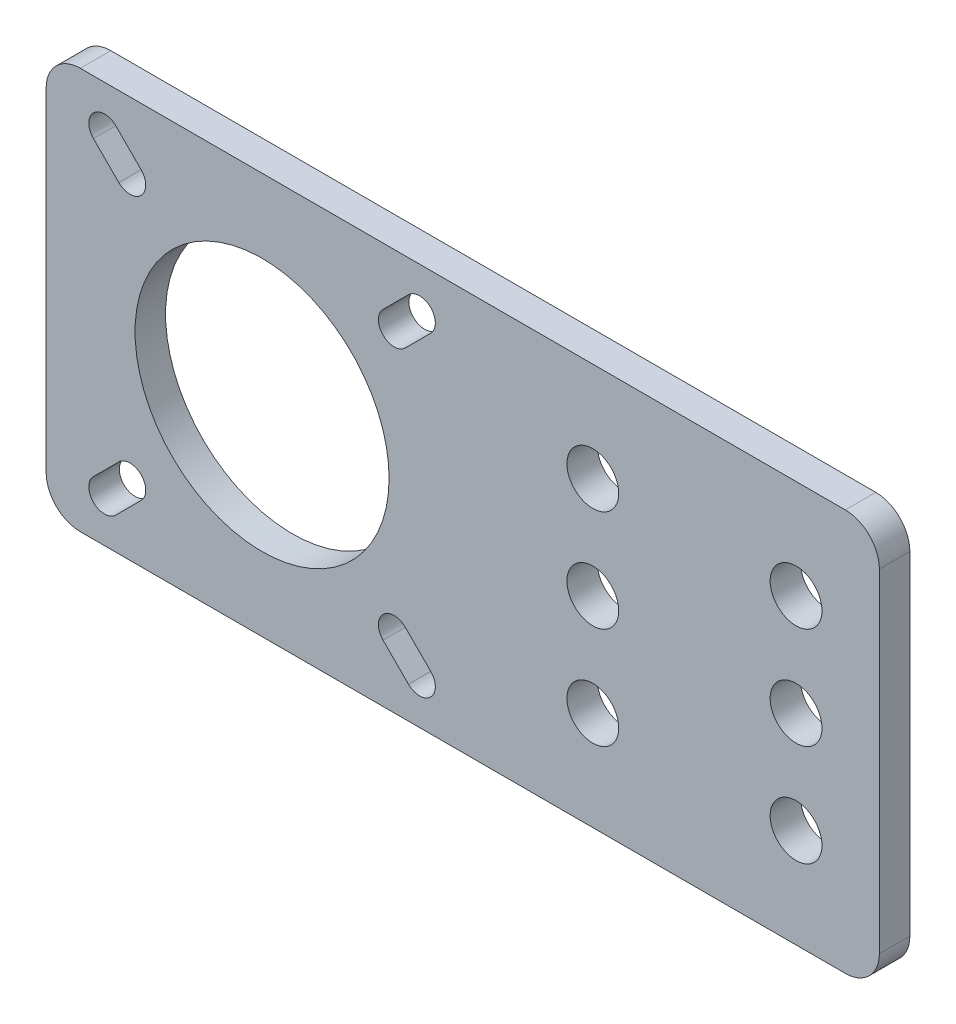
ISO-10303-21;
HEADER;
FILE_DESCRIPTION(('STEP AP214'),'2;1');
FILE_NAME('part.step','',(''),(''),'','','');
FILE_SCHEMA(('AUTOMOTIVE_DESIGN { 1 0 10303 214 1 1 1 1 }'));
ENDSEC;
DATA;
#1=APPLICATION_CONTEXT('core data for automotive mechanical design processes');
#2=APPLICATION_PROTOCOL_DEFINITION('international standard','automotive_design',2000,#1);
#3=PRODUCT_CONTEXT('',#1,'mechanical');
#4=PRODUCT('Part','Part','',(#3));
#5=PRODUCT_RELATED_PRODUCT_CATEGORY('part','',(#4));
#6=PRODUCT_DEFINITION_FORMATION('','',#4);
#7=PRODUCT_DEFINITION_CONTEXT('part definition',#1,'design');
#8=PRODUCT_DEFINITION('design','',#6,#7);
#9=PRODUCT_DEFINITION_SHAPE('','',#8);
#10=(LENGTH_UNIT() NAMED_UNIT(*) SI_UNIT(.MILLI.,.METRE.));
#11=(NAMED_UNIT(*) PLANE_ANGLE_UNIT() SI_UNIT($,.RADIAN.));
#12=(NAMED_UNIT(*) SI_UNIT($,.STERADIAN.) SOLID_ANGLE_UNIT());
#13=UNCERTAINTY_MEASURE_WITH_UNIT(LENGTH_MEASURE(1.E-05),#10,'distance_accuracy_value','');
#14=(GEOMETRIC_REPRESENTATION_CONTEXT(3) GLOBAL_UNCERTAINTY_ASSIGNED_CONTEXT((#13)) GLOBAL_UNIT_ASSIGNED_CONTEXT((#10,
#11,#12)) REPRESENTATION_CONTEXT('',''));
#15=CARTESIAN_POINT('',(0.,0.,0.));
#16=DIRECTION('',(0.,0.,1.));
#17=DIRECTION('',(1.,0.,0.));
#18=AXIS2_PLACEMENT_3D('',#15,#16,#17);
#19=CARTESIAN_POINT('',(-37.64,-16.39,1.5));
#20=DIRECTION('',(0.,0.,-1.));
#21=DIRECTION('',(-1.,0.,0.));
#22=AXIS2_PLACEMENT_3D('',#19,#20,#21);
#23=PLANE('',#22);
#24=CARTESIAN_POINT('',(12.8,-10.,1.5));
#25=DIRECTION('',(0.,0.,1.));
#26=DIRECTION('',(1.,0.,0.));
#27=AXIS2_PLACEMENT_3D('',#24,#25,#26);
#28=CIRCLE('',#27,2.55);
#29=CARTESIAN_POINT('',(15.35,-10.,1.5));
#30=VERTEX_POINT('',#29);
#31=EDGE_CURVE('E482',#30,#30,#28,.T.);
#32=ORIENTED_EDGE('',*,*,#31,.F.);
#33=EDGE_LOOP('',(#32));
#34=FACE_BOUND('',#33,.T.);
#35=CARTESIAN_POINT('',(12.8,0.,1.5));
#36=DIRECTION('',(0.,0.,1.));
#37=DIRECTION('',(1.,0.,0.));
#38=AXIS2_PLACEMENT_3D('',#35,#36,#37);
#39=CIRCLE('',#38,2.5500000000001);
#40=CARTESIAN_POINT('',(15.3500000000001,0.,1.5));
#41=VERTEX_POINT('',#40);
#42=EDGE_CURVE('E492',#41,#41,#39,.T.);
#43=ORIENTED_EDGE('',*,*,#42,.F.);
#44=EDGE_LOOP('',(#43));
#45=FACE_BOUND('',#44,.T.);
#46=CARTESIAN_POINT('',(12.8,10.,1.5));
#47=DIRECTION('',(0.,0.,1.));
#48=DIRECTION('',(1.,0.,0.));
#49=AXIS2_PLACEMENT_3D('',#46,#47,#48);
#50=CIRCLE('',#49,2.55);
#51=CARTESIAN_POINT('',(15.35,10.,1.5));
#52=VERTEX_POINT('',#51);
#53=EDGE_CURVE('E222',#52,#52,#50,.T.);
#54=ORIENTED_EDGE('',*,*,#53,.F.);
#55=EDGE_LOOP('',(#54));
#56=FACE_BOUND('',#55,.T.);
#57=CARTESIAN_POINT('',(-4.2499999999999,-15.5000000000001,1.5));
#58=DIRECTION('',(0.,0.,1.));
#59=DIRECTION('',(1.,0.,0.));
#60=AXIS2_PLACEMENT_3D('',#57,#58,#59);
#61=CIRCLE('',#60,1.55);
#62=CARTESIAN_POINT('',(-5.34601551083905,-16.5960155108392,1.5));
#63=VERTEX_POINT('',#62);
#64=CARTESIAN_POINT('',(-3.15398448916075,-14.4039844891609,1.5));
#65=VERTEX_POINT('',#64);
#66=EDGE_CURVE('E232',#63,#65,#61,.T.);
#67=ORIENTED_EDGE('',*,*,#66,.F.);
#68=DIRECTION('',(0.707106781186546,-0.707106781186549,0.));
#69=VECTOR('',#68,1.);
#70=CARTESIAN_POINT('',(-5.34601551083905,-16.5960155108392,1.5));
#71=LINE('',#70,#69);
#72=CARTESIAN_POINT('',(-7.84601551083907,-14.0960155108392,1.5));
#73=VERTEX_POINT('',#72);
#74=EDGE_CURVE('E240',#73,#63,#71,.T.);
#75=ORIENTED_EDGE('',*,*,#74,.F.);
#76=CARTESIAN_POINT('',(-6.74999999999991,-13.,1.5));
#77=DIRECTION('',(0.,0.,1.));
#78=DIRECTION('',(1.,0.,0.));
#79=AXIS2_PLACEMENT_3D('',#76,#77,#78);
#80=CIRCLE('',#79,1.55000000000001);
#81=CARTESIAN_POINT('',(-5.65398448916076,-11.9039844891609,1.5));
#82=VERTEX_POINT('',#81);
#83=EDGE_CURVE('E237',#82,#73,#80,.T.);
#84=ORIENTED_EDGE('',*,*,#83,.F.);
#85=DIRECTION('',(-0.707106781186545,0.70710678118655,0.));
#86=VECTOR('',#85,1.);
#87=CARTESIAN_POINT('',(-3.15398448916075,-14.4039844891609,1.5));
#88=LINE('',#87,#86);
#89=EDGE_CURVE('E234',#65,#82,#88,.T.);
#90=ORIENTED_EDGE('',*,*,#89,.F.);
#91=EDGE_LOOP('',(#67,#75,#84,#90));
#92=FACE_BOUND('',#91,.T.);
#93=CARTESIAN_POINT('',(-4.24999999999989,15.5,1.5));
#94=DIRECTION('',(0.,0.,1.));
#95=DIRECTION('',(1.,0.,0.));
#96=AXIS2_PLACEMENT_3D('',#93,#94,#95);
#97=CIRCLE('',#96,1.55000000000001);
#98=CARTESIAN_POINT('',(-3.15398448916074,14.4039844891609,1.5));
#99=VERTEX_POINT('',#98);
#100=CARTESIAN_POINT('',(-5.34601551083904,16.5960155108392,1.5));
#101=VERTEX_POINT('',#100);
#102=EDGE_CURVE('E294',#99,#101,#97,.T.);
#103=ORIENTED_EDGE('',*,*,#102,.F.);
#104=DIRECTION('',(0.70710678118655,0.707106781186545,0.));
#105=VECTOR('',#104,1.);
#106=CARTESIAN_POINT('',(-3.15398448916074,14.4039844891609,1.5));
#107=LINE('',#106,#105);
#108=CARTESIAN_POINT('',(-5.65398448916076,11.9039844891609,1.5));
#109=VERTEX_POINT('',#108);
#110=EDGE_CURVE('E302',#109,#99,#107,.T.);
#111=ORIENTED_EDGE('',*,*,#110,.F.);
#112=CARTESIAN_POINT('',(-6.74999999999992,13.,1.5));
#113=DIRECTION('',(0.,0.,1.));
#114=DIRECTION('',(1.,0.,0.));
#115=AXIS2_PLACEMENT_3D('',#112,#113,#114);
#116=CIRCLE('',#115,1.55000000000001);
#117=CARTESIAN_POINT('',(-7.84601551083907,14.0960155108392,1.5));
#118=VERTEX_POINT('',#117);
#119=EDGE_CURVE('E299',#118,#109,#116,.T.);
#120=ORIENTED_EDGE('',*,*,#119,.F.);
#121=DIRECTION('',(-0.70710678118655,-0.707106781186545,0.));
#122=VECTOR('',#121,1.);
#123=CARTESIAN_POINT('',(-5.34601551083904,16.5960155108392,1.5));
#124=LINE('',#123,#122);
#125=EDGE_CURVE('E296',#101,#118,#124,.T.);
#126=ORIENTED_EDGE('',*,*,#125,.F.);
#127=EDGE_LOOP('',(#103,#111,#120,#126));
#128=FACE_BOUND('',#127,.T.);
#129=CARTESIAN_POINT('',(-37.64,-16.39,1.5));
#130=DIRECTION('',(0.,0.,1.));
#131=DIRECTION('',(-1.,0.,0.));
#132=AXIS2_PLACEMENT_3D('',#129,#130,#131);
#133=CIRCLE('',#132,3.36);
#134=CARTESIAN_POINT('',(-41.,-16.39,1.5));
#135=VERTEX_POINT('',#134);
#136=CARTESIAN_POINT('',(-37.64,-19.75,1.5));
#137=VERTEX_POINT('',#136);
#138=EDGE_CURVE('E331',#135,#137,#133,.T.);
#139=ORIENTED_EDGE('',*,*,#138,.T.);
#140=DIRECTION('',(1.,0.,0.));
#141=VECTOR('',#140,1.);
#142=CARTESIAN_POINT('',(-37.64,-19.75,1.5));
#143=LINE('',#142,#141);
#144=CARTESIAN_POINT('',(37.64,-19.75,1.5));
#145=VERTEX_POINT('',#144);
#146=EDGE_CURVE('E334',#137,#145,#143,.T.);
#147=ORIENTED_EDGE('',*,*,#146,.T.);
#148=CARTESIAN_POINT('',(37.64,-16.39,1.5));
#149=DIRECTION('',(0.,0.,1.));
#150=DIRECTION('',(1.,0.,0.));
#151=AXIS2_PLACEMENT_3D('',#148,#149,#150);
#152=CIRCLE('',#151,3.36);
#153=CARTESIAN_POINT('',(41.,-16.39,1.5));
#154=VERTEX_POINT('',#153);
#155=EDGE_CURVE('E337',#145,#154,#152,.T.);
#156=ORIENTED_EDGE('',*,*,#155,.T.);
#157=DIRECTION('',(0.,1.,0.));
#158=VECTOR('',#157,1.);
#159=CARTESIAN_POINT('',(41.,-16.39,1.5));
#160=LINE('',#159,#158);
#161=CARTESIAN_POINT('',(41.,16.39,1.5));
#162=VERTEX_POINT('',#161);
#163=EDGE_CURVE('E339',#154,#162,#160,.T.);
#164=ORIENTED_EDGE('',*,*,#163,.T.);
#165=CARTESIAN_POINT('',(37.64,16.39,1.5));
#166=DIRECTION('',(0.,0.,1.));
#167=DIRECTION('',(-1.,0.,0.));
#168=AXIS2_PLACEMENT_3D('',#165,#166,#167);
#169=CIRCLE('',#168,3.36);
#170=CARTESIAN_POINT('',(37.64,19.75,1.5));
#171=VERTEX_POINT('',#170);
#172=EDGE_CURVE('E341',#162,#171,#169,.T.);
#173=ORIENTED_EDGE('',*,*,#172,.T.);
#174=DIRECTION('',(-1.,0.,0.));
#175=VECTOR('',#174,1.);
#176=CARTESIAN_POINT('',(-37.64,19.75,1.5));
#177=LINE('',#176,#175);
#178=CARTESIAN_POINT('',(-37.64,19.75,1.5));
#179=VERTEX_POINT('',#178);
#180=EDGE_CURVE('E343',#171,#179,#177,.T.);
#181=ORIENTED_EDGE('',*,*,#180,.T.);
#182=CARTESIAN_POINT('',(-37.64,16.39,1.5));
#183=DIRECTION('',(0.,0.,1.));
#184=DIRECTION('',(-1.,0.,0.));
#185=AXIS2_PLACEMENT_3D('',#182,#183,#184);
#186=CIRCLE('',#185,3.36);
#187=CARTESIAN_POINT('',(-41.,16.39,1.5));
#188=VERTEX_POINT('',#187);
#189=EDGE_CURVE('E345',#179,#188,#186,.T.);
#190=ORIENTED_EDGE('',*,*,#189,.T.);
#191=DIRECTION('',(0.,-1.,0.));
#192=VECTOR('',#191,1.);
#193=CARTESIAN_POINT('',(-41.,-16.39,1.5));
#194=LINE('',#193,#192);
#195=EDGE_CURVE('E347',#188,#135,#194,.T.);
#196=ORIENTED_EDGE('',*,*,#195,.T.);
#197=EDGE_LOOP('',(#139,#147,#156,#164,#173,#181,#190,#196));
#198=FACE_BOUND('',#197,.T.);
#199=CARTESIAN_POINT('',(-19.75,0.,1.5));
#200=DIRECTION('',(0.,0.,1.));
#201=DIRECTION('',(1.,0.,0.));
#202=AXIS2_PLACEMENT_3D('',#199,#200,#201);
#203=CIRCLE('',#202,12.5000000000001);
#204=CARTESIAN_POINT('',(-7.24999999999996,0.,1.5));
#205=VERTEX_POINT('',#204);
#206=EDGE_CURVE('E325',#205,#205,#203,.T.);
#207=ORIENTED_EDGE('',*,*,#206,.F.);
#208=EDGE_LOOP('',(#207));
#209=FACE_BOUND('',#208,.T.);
#210=CARTESIAN_POINT('',(-35.25,15.5000000000001,1.5));
#211=DIRECTION('',(0.,0.,1.));
#212=DIRECTION('',(1.,0.,0.));
#213=AXIS2_PLACEMENT_3D('',#210,#211,#212);
#214=CIRCLE('',#213,1.55);
#215=CARTESIAN_POINT('',(-34.1539844891608,16.5960155108392,1.5));
#216=VERTEX_POINT('',#215);
#217=CARTESIAN_POINT('',(-36.3460155108392,14.4039844891609,1.5));
#218=VERTEX_POINT('',#217);
#219=EDGE_CURVE('E263',#216,#218,#214,.T.);
#220=ORIENTED_EDGE('',*,*,#219,.F.);
#221=DIRECTION('',(-0.707106781186545,0.70710678118655,0.));
#222=VECTOR('',#221,1.);
#223=CARTESIAN_POINT('',(-34.1539844891608,16.5960155108392,1.5));
#224=LINE('',#223,#222);
#225=CARTESIAN_POINT('',(-31.6539844891608,14.0960155108392,1.5));
#226=VERTEX_POINT('',#225);
#227=EDGE_CURVE('E271',#226,#216,#224,.T.);
#228=ORIENTED_EDGE('',*,*,#227,.F.);
#229=CARTESIAN_POINT('',(-32.75,13.,1.5));
#230=DIRECTION('',(0.,0.,1.));
#231=DIRECTION('',(1.,0.,0.));
#232=AXIS2_PLACEMENT_3D('',#229,#230,#231);
#233=CIRCLE('',#232,1.55);
#234=CARTESIAN_POINT('',(-33.8460155108391,11.9039844891609,1.5));
#235=VERTEX_POINT('',#234);
#236=EDGE_CURVE('E268',#235,#226,#233,.T.);
#237=ORIENTED_EDGE('',*,*,#236,.F.);
#238=DIRECTION('',(0.707106781186545,-0.70710678118655,0.));
#239=VECTOR('',#238,1.);
#240=CARTESIAN_POINT('',(-36.3460155108392,14.4039844891609,1.5));
#241=LINE('',#240,#239);
#242=EDGE_CURVE('E265',#218,#235,#241,.T.);
#243=ORIENTED_EDGE('',*,*,#242,.F.);
#244=EDGE_LOOP('',(#220,#228,#237,#243));
#245=FACE_BOUND('',#244,.T.);
#246=CARTESIAN_POINT('',(-35.25,-15.5000000000001,1.5));
#247=DIRECTION('',(0.,0.,1.));
#248=DIRECTION('',(1.,0.,0.));
#249=AXIS2_PLACEMENT_3D('',#246,#247,#248);
#250=CIRCLE('',#249,1.55);
#251=CARTESIAN_POINT('',(-36.3460155108392,-14.4039844891609,1.5));
#252=VERTEX_POINT('',#251);
#253=CARTESIAN_POINT('',(-34.1539844891609,-16.5960155108392,1.5));
#254=VERTEX_POINT('',#253);
#255=EDGE_CURVE('E193',#252,#254,#250,.T.);
#256=ORIENTED_EDGE('',*,*,#255,.F.);
#257=DIRECTION('',(-0.707106781186549,-0.707106781186547,0.));
#258=VECTOR('',#257,1.);
#259=CARTESIAN_POINT('',(-36.3460155108392,-14.4039844891609,1.5));
#260=LINE('',#259,#258);
#261=CARTESIAN_POINT('',(-33.8460155108391,-11.9039844891609,1.5));
#262=VERTEX_POINT('',#261);
#263=EDGE_CURVE('E216',#262,#252,#260,.T.);
#264=ORIENTED_EDGE('',*,*,#263,.F.);
#265=CARTESIAN_POINT('',(-32.75,-13.,1.5));
#266=DIRECTION('',(0.,0.,1.));
#267=DIRECTION('',(1.,0.,0.));
#268=AXIS2_PLACEMENT_3D('',#265,#266,#267);
#269=CIRCLE('',#268,1.55000000000001);
#270=CARTESIAN_POINT('',(-31.6539844891608,-14.0960155108392,1.5));
#271=VERTEX_POINT('',#270);
#272=EDGE_CURVE('E214',#271,#262,#269,.T.);
#273=ORIENTED_EDGE('',*,*,#272,.F.);
#274=DIRECTION('',(0.707106781186551,0.707106781186544,0.));
#275=VECTOR('',#274,1.);
#276=CARTESIAN_POINT('',(-34.1539844891609,-16.5960155108392,1.5));
#277=LINE('',#276,#275);
#278=EDGE_CURVE('E201',#254,#271,#277,.T.);
#279=ORIENTED_EDGE('',*,*,#278,.F.);
#280=EDGE_LOOP('',(#256,#264,#273,#279));
#281=FACE_BOUND('',#280,.T.);
#282=CARTESIAN_POINT('',(32.8,10.,1.5));
#283=DIRECTION('',(0.,0.,1.));
#284=DIRECTION('',(1.,0.,0.));
#285=AXIS2_PLACEMENT_3D('',#282,#283,#284);
#286=CIRCLE('',#285,2.55000000000001);
#287=CARTESIAN_POINT('',(35.35,10.,1.5));
#288=VERTEX_POINT('',#287);
#289=EDGE_CURVE('E497',#288,#288,#286,.T.);
#290=ORIENTED_EDGE('',*,*,#289,.F.);
#291=EDGE_LOOP('',(#290));
#292=FACE_BOUND('',#291,.T.);
#293=CARTESIAN_POINT('',(32.8,0.,1.5));
#294=DIRECTION('',(0.,0.,1.));
#295=DIRECTION('',(1.,0.,0.));
#296=AXIS2_PLACEMENT_3D('',#293,#294,#295);
#297=CIRCLE('',#296,2.54999999999999);
#298=CARTESIAN_POINT('',(35.35,0.,1.5));
#299=VERTEX_POINT('',#298);
#300=EDGE_CURVE('E487',#299,#299,#297,.T.);
#301=ORIENTED_EDGE('',*,*,#300,.F.);
#302=EDGE_LOOP('',(#301));
#303=FACE_BOUND('',#302,.T.);
#304=CARTESIAN_POINT('',(32.8,-10.,1.5));
#305=DIRECTION('',(0.,0.,1.));
#306=DIRECTION('',(1.,0.,0.));
#307=AXIS2_PLACEMENT_3D('',#304,#305,#306);
#308=CIRCLE('',#307,2.55000000000001);
#309=CARTESIAN_POINT('',(35.35,-10.,1.5));
#310=VERTEX_POINT('',#309);
#311=EDGE_CURVE('E476',#310,#310,#308,.T.);
#312=ORIENTED_EDGE('',*,*,#311,.F.);
#313=EDGE_LOOP('',(#312));
#314=FACE_BOUND('',#313,.T.);
#315=ADVANCED_FACE('F32',(#34,#45,#56,#92,#128,#198,#209,#245,#281,#292,#303,#314),#23,.F.);
#316=CARTESIAN_POINT('',(-37.64,-16.39,-1.5));
#317=DIRECTION('',(0.,0.,-1.));
#318=DIRECTION('',(-1.,0.,0.));
#319=AXIS2_PLACEMENT_3D('',#316,#317,#318);
#320=PLANE('',#319);
#321=CARTESIAN_POINT('',(12.8,-10.,-1.5));
#322=DIRECTION('',(0.,0.,1.));
#323=DIRECTION('',(1.,0.,0.));
#324=AXIS2_PLACEMENT_3D('',#321,#322,#323);
#325=CIRCLE('',#324,2.55);
#326=CARTESIAN_POINT('',(15.35,-10.,-1.5));
#327=VERTEX_POINT('',#326);
#328=EDGE_CURVE('E479',#327,#327,#325,.T.);
#329=ORIENTED_EDGE('',*,*,#328,.T.);
#330=EDGE_LOOP('',(#329));
#331=FACE_BOUND('',#330,.T.);
#332=CARTESIAN_POINT('',(12.8,0.,-1.5));
#333=DIRECTION('',(0.,0.,1.));
#334=DIRECTION('',(1.,0.,0.));
#335=AXIS2_PLACEMENT_3D('',#332,#333,#334);
#336=CIRCLE('',#335,2.5500000000001);
#337=CARTESIAN_POINT('',(15.3500000000001,0.,-1.5));
#338=VERTEX_POINT('',#337);
#339=EDGE_CURVE('E490',#338,#338,#336,.T.);
#340=ORIENTED_EDGE('',*,*,#339,.T.);
#341=EDGE_LOOP('',(#340));
#342=FACE_BOUND('',#341,.T.);
#343=CARTESIAN_POINT('',(12.8,10.,-1.5));
#344=DIRECTION('',(0.,0.,1.));
#345=DIRECTION('',(1.,0.,0.));
#346=AXIS2_PLACEMENT_3D('',#343,#344,#345);
#347=CIRCLE('',#346,2.55);
#348=CARTESIAN_POINT('',(15.35,10.,-1.5));
#349=VERTEX_POINT('',#348);
#350=EDGE_CURVE('E500',#349,#349,#347,.T.);
#351=ORIENTED_EDGE('',*,*,#350,.T.);
#352=EDGE_LOOP('',(#351));
#353=FACE_BOUND('',#352,.T.);
#354=DIRECTION('',(0.707106781186546,-0.707106781186549,0.));
#355=VECTOR('',#354,1.);
#356=CARTESIAN_POINT('',(-5.34601551083905,-16.5960155108392,-1.5));
#357=LINE('',#356,#355);
#358=CARTESIAN_POINT('',(-7.84601551083907,-14.0960155108392,-1.5));
#359=VERTEX_POINT('',#358);
#360=CARTESIAN_POINT('',(-5.34601551083905,-16.5960155108392,-1.5));
#361=VERTEX_POINT('',#360);
#362=EDGE_CURVE('E235',#359,#361,#357,.T.);
#363=ORIENTED_EDGE('',*,*,#362,.T.);
#364=CARTESIAN_POINT('',(-4.2499999999999,-15.5000000000001,-1.5));
#365=DIRECTION('',(0.,0.,1.));
#366=DIRECTION('',(1.,0.,0.));
#367=AXIS2_PLACEMENT_3D('',#364,#365,#366);
#368=CIRCLE('',#367,1.55);
#369=CARTESIAN_POINT('',(-3.15398448916075,-14.4039844891609,-1.5));
#370=VERTEX_POINT('',#369);
#371=EDGE_CURVE('E209',#361,#370,#368,.T.);
#372=ORIENTED_EDGE('',*,*,#371,.T.);
#373=DIRECTION('',(-0.707106781186545,0.70710678118655,0.));
#374=VECTOR('',#373,1.);
#375=CARTESIAN_POINT('',(-3.15398448916075,-14.4039844891609,-1.5));
#376=LINE('',#375,#374);
#377=CARTESIAN_POINT('',(-5.65398448916076,-11.9039844891609,-1.5));
#378=VERTEX_POINT('',#377);
#379=EDGE_CURVE('E245',#370,#378,#376,.T.);
#380=ORIENTED_EDGE('',*,*,#379,.T.);
#381=CARTESIAN_POINT('',(-6.74999999999991,-13.,-1.5));
#382=DIRECTION('',(0.,0.,1.));
#383=DIRECTION('',(1.,0.,0.));
#384=AXIS2_PLACEMENT_3D('',#381,#382,#383);
#385=CIRCLE('',#384,1.55000000000001);
#386=EDGE_CURVE('E248',#378,#359,#385,.T.);
#387=ORIENTED_EDGE('',*,*,#386,.T.);
#388=EDGE_LOOP('',(#363,#372,#380,#387));
#389=FACE_BOUND('',#388,.T.);
#390=DIRECTION('',(0.70710678118655,0.707106781186545,0.));
#391=VECTOR('',#390,1.);
#392=CARTESIAN_POINT('',(-3.15398448916074,14.4039844891609,-1.5));
#393=LINE('',#392,#391);
#394=CARTESIAN_POINT('',(-5.65398448916077,11.9039844891609,-1.5));
#395=VERTEX_POINT('',#394);
#396=CARTESIAN_POINT('',(-3.15398448916074,14.4039844891609,-1.5));
#397=VERTEX_POINT('',#396);
#398=EDGE_CURVE('E297',#395,#397,#393,.T.);
#399=ORIENTED_EDGE('',*,*,#398,.T.);
#400=CARTESIAN_POINT('',(-4.24999999999989,15.5,-1.5));
#401=DIRECTION('',(0.,0.,1.));
#402=DIRECTION('',(1.,0.,0.));
#403=AXIS2_PLACEMENT_3D('',#400,#401,#402);
#404=CIRCLE('',#403,1.55000000000001);
#405=CARTESIAN_POINT('',(-5.34601551083904,16.5960155108392,-1.5));
#406=VERTEX_POINT('',#405);
#407=EDGE_CURVE('E293',#397,#406,#404,.T.);
#408=ORIENTED_EDGE('',*,*,#407,.T.);
#409=DIRECTION('',(-0.70710678118655,-0.707106781186545,0.));
#410=VECTOR('',#409,1.);
#411=CARTESIAN_POINT('',(-5.34601551083904,16.5960155108392,-1.5));
#412=LINE('',#411,#410);
#413=CARTESIAN_POINT('',(-7.84601551083907,14.0960155108392,-1.5));
#414=VERTEX_POINT('',#413);
#415=EDGE_CURVE('E307',#406,#414,#412,.T.);
#416=ORIENTED_EDGE('',*,*,#415,.T.);
#417=CARTESIAN_POINT('',(-6.74999999999992,13.,-1.5));
#418=DIRECTION('',(0.,0.,1.));
#419=DIRECTION('',(1.,0.,0.));
#420=AXIS2_PLACEMENT_3D('',#417,#418,#419);
#421=CIRCLE('',#420,1.55000000000001);
#422=EDGE_CURVE('E310',#414,#395,#421,.T.);
#423=ORIENTED_EDGE('',*,*,#422,.T.);
#424=EDGE_LOOP('',(#399,#408,#416,#423));
#425=FACE_BOUND('',#424,.T.);
#426=CARTESIAN_POINT('',(-37.64,-16.39,-1.5));
#427=DIRECTION('',(0.,0.,1.));
#428=DIRECTION('',(-1.,0.,0.));
#429=AXIS2_PLACEMENT_3D('',#426,#427,#428);
#430=CIRCLE('',#429,3.36);
#431=CARTESIAN_POINT('',(-41.,-16.39,-1.5));
#432=VERTEX_POINT('',#431);
#433=CARTESIAN_POINT('',(-37.64,-19.75,-1.5));
#434=VERTEX_POINT('',#433);
#435=EDGE_CURVE('E328',#432,#434,#430,.T.);
#436=ORIENTED_EDGE('',*,*,#435,.F.);
#437=DIRECTION('',(0.,-1.,0.));
#438=VECTOR('',#437,1.);
#439=CARTESIAN_POINT('',(-41.,-16.39,-1.5));
#440=LINE('',#439,#438);
#441=CARTESIAN_POINT('',(-41.,16.39,-1.5));
#442=VERTEX_POINT('',#441);
#443=EDGE_CURVE('E335',#442,#432,#440,.T.);
#444=ORIENTED_EDGE('',*,*,#443,.F.);
#445=CARTESIAN_POINT('',(-37.64,16.39,-1.5));
#446=DIRECTION('',(0.,0.,1.));
#447=DIRECTION('',(-1.,0.,0.));
#448=AXIS2_PLACEMENT_3D('',#445,#446,#447);
#449=CIRCLE('',#448,3.36);
#450=CARTESIAN_POINT('',(-37.64,19.75,-1.5));
#451=VERTEX_POINT('',#450);
#452=EDGE_CURVE('E362',#451,#442,#449,.T.);
#453=ORIENTED_EDGE('',*,*,#452,.F.);
#454=DIRECTION('',(-1.,0.,0.));
#455=VECTOR('',#454,1.);
#456=CARTESIAN_POINT('',(-37.64,19.75,-1.5));
#457=LINE('',#456,#455);
#458=CARTESIAN_POINT('',(37.64,19.75,-1.5));
#459=VERTEX_POINT('',#458);
#460=EDGE_CURVE('E360',#459,#451,#457,.T.);
#461=ORIENTED_EDGE('',*,*,#460,.F.);
#462=CARTESIAN_POINT('',(37.64,16.39,-1.5));
#463=DIRECTION('',(0.,0.,1.));
#464=DIRECTION('',(-1.,0.,0.));
#465=AXIS2_PLACEMENT_3D('',#462,#463,#464);
#466=CIRCLE('',#465,3.36);
#467=CARTESIAN_POINT('',(41.,16.39,-1.5));
#468=VERTEX_POINT('',#467);
#469=EDGE_CURVE('E358',#468,#459,#466,.T.);
#470=ORIENTED_EDGE('',*,*,#469,.F.);
#471=DIRECTION('',(0.,1.,0.));
#472=VECTOR('',#471,1.);
#473=CARTESIAN_POINT('',(41.,-16.39,-1.5));
#474=LINE('',#473,#472);
#475=CARTESIAN_POINT('',(41.,-16.39,-1.5));
#476=VERTEX_POINT('',#475);
#477=EDGE_CURVE('E356',#476,#468,#474,.T.);
#478=ORIENTED_EDGE('',*,*,#477,.F.);
#479=CARTESIAN_POINT('',(37.64,-16.39,-1.5));
#480=DIRECTION('',(0.,0.,1.));
#481=DIRECTION('',(1.,0.,0.));
#482=AXIS2_PLACEMENT_3D('',#479,#480,#481);
#483=CIRCLE('',#482,3.36);
#484=CARTESIAN_POINT('',(37.64,-19.75,-1.5));
#485=VERTEX_POINT('',#484);
#486=EDGE_CURVE('E354',#485,#476,#483,.T.);
#487=ORIENTED_EDGE('',*,*,#486,.F.);
#488=DIRECTION('',(1.,0.,0.));
#489=VECTOR('',#488,1.);
#490=CARTESIAN_POINT('',(-37.64,-19.75,-1.5));
#491=LINE('',#490,#489);
#492=EDGE_CURVE('E352',#434,#485,#491,.T.);
#493=ORIENTED_EDGE('',*,*,#492,.F.);
#494=EDGE_LOOP('',(#436,#444,#453,#461,#470,#478,#487,#493));
#495=FACE_BOUND('',#494,.T.);
#496=CARTESIAN_POINT('',(-19.75,0.,-1.5));
#497=DIRECTION('',(0.,0.,1.));
#498=DIRECTION('',(1.,0.,0.));
#499=AXIS2_PLACEMENT_3D('',#496,#497,#498);
#500=CIRCLE('',#499,12.5000000000001);
#501=CARTESIAN_POINT('',(-7.24999999999996,0.,-1.5));
#502=VERTEX_POINT('',#501);
#503=EDGE_CURVE('E324',#502,#502,#500,.T.);
#504=ORIENTED_EDGE('',*,*,#503,.T.);
#505=EDGE_LOOP('',(#504));
#506=FACE_BOUND('',#505,.T.);
#507=DIRECTION('',(-0.707106781186545,0.70710678118655,0.));
#508=VECTOR('',#507,1.);
#509=CARTESIAN_POINT('',(-34.1539844891608,16.5960155108392,-1.5));
#510=LINE('',#509,#508);
#511=CARTESIAN_POINT('',(-31.6539844891608,14.0960155108392,-1.5));
#512=VERTEX_POINT('',#511);
#513=CARTESIAN_POINT('',(-34.1539844891608,16.5960155108392,-1.5));
#514=VERTEX_POINT('',#513);
#515=EDGE_CURVE('E266',#512,#514,#510,.T.);
#516=ORIENTED_EDGE('',*,*,#515,.T.);
#517=CARTESIAN_POINT('',(-35.25,15.5000000000001,-1.5));
#518=DIRECTION('',(0.,0.,1.));
#519=DIRECTION('',(1.,0.,0.));
#520=AXIS2_PLACEMENT_3D('',#517,#518,#519);
#521=CIRCLE('',#520,1.55);
#522=CARTESIAN_POINT('',(-36.3460155108392,14.4039844891609,-1.5));
#523=VERTEX_POINT('',#522);
#524=EDGE_CURVE('E262',#514,#523,#521,.T.);
#525=ORIENTED_EDGE('',*,*,#524,.T.);
#526=DIRECTION('',(0.707106781186545,-0.70710678118655,0.));
#527=VECTOR('',#526,1.);
#528=CARTESIAN_POINT('',(-36.3460155108392,14.4039844891609,-1.5));
#529=LINE('',#528,#527);
#530=CARTESIAN_POINT('',(-33.8460155108391,11.9039844891609,-1.5));
#531=VERTEX_POINT('',#530);
#532=EDGE_CURVE('E276',#523,#531,#529,.T.);
#533=ORIENTED_EDGE('',*,*,#532,.T.);
#534=CARTESIAN_POINT('',(-32.75,13.,-1.5));
#535=DIRECTION('',(0.,0.,1.));
#536=DIRECTION('',(1.,0.,0.));
#537=AXIS2_PLACEMENT_3D('',#534,#535,#536);
#538=CIRCLE('',#537,1.55);
#539=EDGE_CURVE('E279',#531,#512,#538,.T.);
#540=ORIENTED_EDGE('',*,*,#539,.T.);
#541=EDGE_LOOP('',(#516,#525,#533,#540));
#542=FACE_BOUND('',#541,.T.);
#543=DIRECTION('',(-0.707106781186549,-0.707106781186547,0.));
#544=VECTOR('',#543,1.);
#545=CARTESIAN_POINT('',(-36.3460155108392,-14.4039844891609,-1.5));
#546=LINE('',#545,#544);
#547=CARTESIAN_POINT('',(-33.8460155108391,-11.9039844891609,-1.5));
#548=VERTEX_POINT('',#547);
#549=CARTESIAN_POINT('',(-36.3460155108392,-14.4039844891609,-1.5));
#550=VERTEX_POINT('',#549);
#551=EDGE_CURVE('E202',#548,#550,#546,.T.);
#552=ORIENTED_EDGE('',*,*,#551,.T.);
#553=CARTESIAN_POINT('',(-35.25,-15.5000000000001,-1.5));
#554=DIRECTION('',(0.,0.,1.));
#555=DIRECTION('',(1.,0.,0.));
#556=AXIS2_PLACEMENT_3D('',#553,#554,#555);
#557=CIRCLE('',#556,1.55);
#558=CARTESIAN_POINT('',(-34.1539844891609,-16.5960155108392,-1.5));
#559=VERTEX_POINT('',#558);
#560=EDGE_CURVE('E55',#550,#559,#557,.T.);
#561=ORIENTED_EDGE('',*,*,#560,.T.);
#562=DIRECTION('',(0.707106781186551,0.707106781186544,0.));
#563=VECTOR('',#562,1.);
#564=CARTESIAN_POINT('',(-34.1539844891609,-16.5960155108392,-1.5));
#565=LINE('',#564,#563);
#566=CARTESIAN_POINT('',(-31.6539844891608,-14.0960155108392,-1.5));
#567=VERTEX_POINT('',#566);
#568=EDGE_CURVE('E208',#559,#567,#565,.T.);
#569=ORIENTED_EDGE('',*,*,#568,.T.);
#570=CARTESIAN_POINT('',(-32.75,-13.,-1.5));
#571=DIRECTION('',(0.,0.,1.));
#572=DIRECTION('',(1.,0.,0.));
#573=AXIS2_PLACEMENT_3D('',#570,#571,#572);
#574=CIRCLE('',#573,1.55000000000001);
#575=EDGE_CURVE('E224',#567,#548,#574,.T.);
#576=ORIENTED_EDGE('',*,*,#575,.T.);
#577=EDGE_LOOP('',(#552,#561,#569,#576));
#578=FACE_BOUND('',#577,.T.);
#579=CARTESIAN_POINT('',(32.8,10.,-1.5));
#580=DIRECTION('',(0.,0.,1.));
#581=DIRECTION('',(1.,0.,0.));
#582=AXIS2_PLACEMENT_3D('',#579,#580,#581);
#583=CIRCLE('',#582,2.55000000000001);
#584=CARTESIAN_POINT('',(35.35,10.,-1.5));
#585=VERTEX_POINT('',#584);
#586=EDGE_CURVE('E467',#585,#585,#583,.T.);
#587=ORIENTED_EDGE('',*,*,#586,.T.);
#588=EDGE_LOOP('',(#587));
#589=FACE_BOUND('',#588,.T.);
#590=CARTESIAN_POINT('',(32.8,0.,-1.5));
#591=DIRECTION('',(0.,0.,1.));
#592=DIRECTION('',(1.,0.,0.));
#593=AXIS2_PLACEMENT_3D('',#590,#591,#592);
#594=CIRCLE('',#593,2.54999999999999);
#595=CARTESIAN_POINT('',(35.35,0.,-1.5));
#596=VERTEX_POINT('',#595);
#597=EDGE_CURVE('E471',#596,#596,#594,.T.);
#598=ORIENTED_EDGE('',*,*,#597,.T.);
#599=EDGE_LOOP('',(#598));
#600=FACE_BOUND('',#599,.T.);
#601=CARTESIAN_POINT('',(32.8,-10.,-1.5));
#602=DIRECTION('',(0.,0.,1.));
#603=DIRECTION('',(1.,0.,0.));
#604=AXIS2_PLACEMENT_3D('',#601,#602,#603);
#605=CIRCLE('',#604,2.55000000000001);
#606=CARTESIAN_POINT('',(35.35,-10.,-1.5));
#607=VERTEX_POINT('',#606);
#608=EDGE_CURVE('E474',#607,#607,#605,.T.);
#609=ORIENTED_EDGE('',*,*,#608,.T.);
#610=EDGE_LOOP('',(#609));
#611=FACE_BOUND('',#610,.T.);
#612=ADVANCED_FACE('F392',(#331,#342,#353,#389,#425,#495,#506,#542,#578,#589,#600,#611),#320,.T.);
#613=CARTESIAN_POINT('',(-37.64,-16.39,1.5));
#614=DIRECTION('',(0.,0.,-1.));
#615=DIRECTION('',(-1.,0.,0.));
#616=AXIS2_PLACEMENT_3D('',#613,#614,#615);
#617=CYLINDRICAL_SURFACE('',#616,3.36);
#618=ORIENTED_EDGE('',*,*,#435,.T.);
#619=DIRECTION('',(0.,0.,-1.));
#620=VECTOR('',#619,1.);
#621=CARTESIAN_POINT('',(-37.64,-19.75,1.5));
#622=LINE('',#621,#620);
#623=EDGE_CURVE('E11',#137,#434,#622,.T.);
#624=ORIENTED_EDGE('',*,*,#623,.F.);
#625=ORIENTED_EDGE('',*,*,#138,.F.);
#626=DIRECTION('',(0.,0.,-1.));
#627=VECTOR('',#626,1.);
#628=CARTESIAN_POINT('',(-41.,-16.39,1.5));
#629=LINE('',#628,#627);
#630=EDGE_CURVE('E349',#135,#432,#629,.T.);
#631=ORIENTED_EDGE('',*,*,#630,.T.);
#632=EDGE_LOOP('',(#618,#624,#625,#631));
#633=FACE_BOUND('',#632,.T.);
#634=ADVANCED_FACE('F34',(#633),#617,.T.);
#635=CARTESIAN_POINT('',(-37.64,-19.75,1.5));
#636=DIRECTION('',(0.,1.,0.));
#637=DIRECTION('',(0.,0.,1.));
#638=AXIS2_PLACEMENT_3D('',#635,#636,#637);
#639=PLANE('',#638);
#640=ORIENTED_EDGE('',*,*,#492,.T.);
#641=DIRECTION('',(0.,0.,-1.));
#642=VECTOR('',#641,1.);
#643=CARTESIAN_POINT('',(37.64,-19.75,1.5));
#644=LINE('',#643,#642);
#645=EDGE_CURVE('E40',#145,#485,#644,.T.);
#646=ORIENTED_EDGE('',*,*,#645,.F.);
#647=ORIENTED_EDGE('',*,*,#146,.F.);
#648=ORIENTED_EDGE('',*,*,#623,.T.);
#649=EDGE_LOOP('',(#640,#646,#647,#648));
#650=FACE_BOUND('',#649,.T.);
#651=ADVANCED_FACE('F410',(#650),#639,.F.);
#652=CARTESIAN_POINT('',(37.64,-16.39,1.5));
#653=DIRECTION('',(0.,0.,-1.));
#654=DIRECTION('',(-1.,0.,0.));
#655=AXIS2_PLACEMENT_3D('',#652,#653,#654);
#656=CYLINDRICAL_SURFACE('',#655,3.36);
#657=ORIENTED_EDGE('',*,*,#486,.T.);
#658=DIRECTION('',(0.,0.,-1.));
#659=VECTOR('',#658,1.);
#660=CARTESIAN_POINT('',(41.,-16.39,1.5));
#661=LINE('',#660,#659);
#662=EDGE_CURVE('E379',#154,#476,#661,.T.);
#663=ORIENTED_EDGE('',*,*,#662,.F.);
#664=ORIENTED_EDGE('',*,*,#155,.F.);
#665=ORIENTED_EDGE('',*,*,#645,.T.);
#666=EDGE_LOOP('',(#657,#663,#664,#665));
#667=FACE_BOUND('',#666,.T.);
#668=ADVANCED_FACE('F386',(#667),#656,.T.);
#669=CARTESIAN_POINT('',(41.,-16.39,1.5));
#670=DIRECTION('',(-1.,0.,0.));
#671=DIRECTION('',(0.,0.,1.));
#672=AXIS2_PLACEMENT_3D('',#669,#670,#671);
#673=PLANE('',#672);
#674=ORIENTED_EDGE('',*,*,#477,.T.);
#675=DIRECTION('',(0.,0.,-1.));
#676=VECTOR('',#675,1.);
#677=CARTESIAN_POINT('',(41.,16.39,1.5));
#678=LINE('',#677,#676);
#679=EDGE_CURVE('E376',#162,#468,#678,.T.);
#680=ORIENTED_EDGE('',*,*,#679,.F.);
#681=ORIENTED_EDGE('',*,*,#163,.F.);
#682=ORIENTED_EDGE('',*,*,#662,.T.);
#683=EDGE_LOOP('',(#674,#680,#681,#682));
#684=FACE_BOUND('',#683,.T.);
#685=ADVANCED_FACE('F398',(#684),#673,.F.);
#686=CARTESIAN_POINT('',(37.64,16.39,1.5));
#687=DIRECTION('',(0.,0.,-1.));
#688=DIRECTION('',(-1.,0.,0.));
#689=AXIS2_PLACEMENT_3D('',#686,#687,#688);
#690=CYLINDRICAL_SURFACE('',#689,3.36);
#691=ORIENTED_EDGE('',*,*,#469,.T.);
#692=DIRECTION('',(0.,0.,-1.));
#693=VECTOR('',#692,1.);
#694=CARTESIAN_POINT('',(37.64,19.75,1.5));
#695=LINE('',#694,#693);
#696=EDGE_CURVE('E373',#171,#459,#695,.T.);
#697=ORIENTED_EDGE('',*,*,#696,.F.);
#698=ORIENTED_EDGE('',*,*,#172,.F.);
#699=ORIENTED_EDGE('',*,*,#679,.T.);
#700=EDGE_LOOP('',(#691,#697,#698,#699));
#701=FACE_BOUND('',#700,.T.);
#702=ADVANCED_FACE('F402',(#701),#690,.T.);
#703=CARTESIAN_POINT('',(-37.64,19.75,1.5));
#704=DIRECTION('',(0.,-1.,0.));
#705=DIRECTION('',(1.,0.,0.));
#706=AXIS2_PLACEMENT_3D('',#703,#704,#705);
#707=PLANE('',#706);
#708=ORIENTED_EDGE('',*,*,#460,.T.);
#709=DIRECTION('',(0.,0.,-1.));
#710=VECTOR('',#709,1.);
#711=CARTESIAN_POINT('',(-37.64,19.75,1.5));
#712=LINE('',#711,#710);
#713=EDGE_CURVE('E370',#179,#451,#712,.T.);
#714=ORIENTED_EDGE('',*,*,#713,.F.);
#715=ORIENTED_EDGE('',*,*,#180,.F.);
#716=ORIENTED_EDGE('',*,*,#696,.T.);
#717=EDGE_LOOP('',(#708,#714,#715,#716));
#718=FACE_BOUND('',#717,.T.);
#719=ADVANCED_FACE('F423',(#718),#707,.F.);
#720=CARTESIAN_POINT('',(-37.64,16.39,1.5));
#721=DIRECTION('',(0.,0.,-1.));
#722=DIRECTION('',(-1.,0.,0.));
#723=AXIS2_PLACEMENT_3D('',#720,#721,#722);
#724=CYLINDRICAL_SURFACE('',#723,3.36);
#725=ORIENTED_EDGE('',*,*,#452,.T.);
#726=DIRECTION('',(0.,0.,-1.));
#727=VECTOR('',#726,1.);
#728=CARTESIAN_POINT('',(-41.,16.39,1.5));
#729=LINE('',#728,#727);
#730=EDGE_CURVE('E367',#188,#442,#729,.T.);
#731=ORIENTED_EDGE('',*,*,#730,.F.);
#732=ORIENTED_EDGE('',*,*,#189,.F.);
#733=ORIENTED_EDGE('',*,*,#713,.T.);
#734=EDGE_LOOP('',(#725,#731,#732,#733));
#735=FACE_BOUND('',#734,.T.);
#736=ADVANCED_FACE('F421',(#735),#724,.T.);
#737=CARTESIAN_POINT('',(-41.,-16.39,1.5));
#738=DIRECTION('',(1.,0.,0.));
#739=DIRECTION('',(0.,0.,-1.));
#740=AXIS2_PLACEMENT_3D('',#737,#738,#739);
#741=PLANE('',#740);
#742=ORIENTED_EDGE('',*,*,#443,.T.);
#743=ORIENTED_EDGE('',*,*,#630,.F.);
#744=ORIENTED_EDGE('',*,*,#195,.F.);
#745=ORIENTED_EDGE('',*,*,#730,.T.);
#746=EDGE_LOOP('',(#742,#743,#744,#745));
#747=FACE_BOUND('',#746,.T.);
#748=ADVANCED_FACE('F416',(#747),#741,.F.);
#749=CARTESIAN_POINT('',(-19.75,0.,1.5));
#750=DIRECTION('',(0.,0.,-1.));
#751=DIRECTION('',(-1.,0.,0.));
#752=AXIS2_PLACEMENT_3D('',#749,#750,#751);
#753=CYLINDRICAL_SURFACE('',#752,12.5000000000001);
#754=ORIENTED_EDGE('',*,*,#206,.T.);
#755=EDGE_LOOP('',(#754));
#756=FACE_BOUND('',#755,.T.);
#757=ORIENTED_EDGE('',*,*,#503,.F.);
#758=EDGE_LOOP('',(#757));
#759=FACE_BOUND('',#758,.T.);
#760=ADVANCED_FACE('F443',(#756,#759),#753,.F.);
#761=CARTESIAN_POINT('',(-4.24999999999989,15.5,1.5));
#762=DIRECTION('',(0.,0.,-1.));
#763=DIRECTION('',(-1.,0.,0.));
#764=AXIS2_PLACEMENT_3D('',#761,#762,#763);
#765=CYLINDRICAL_SURFACE('',#764,1.55000000000001);
#766=ORIENTED_EDGE('',*,*,#407,.F.);
#767=DIRECTION('',(0.,0.,-1.));
#768=VECTOR('',#767,1.);
#769=CARTESIAN_POINT('',(-3.15398448916074,14.4039844891609,1.5));
#770=LINE('',#769,#768);
#771=EDGE_CURVE('E304',#99,#397,#770,.T.);
#772=ORIENTED_EDGE('',*,*,#771,.F.);
#773=ORIENTED_EDGE('',*,*,#102,.T.);
#774=DIRECTION('',(0.,0.,-1.));
#775=VECTOR('',#774,1.);
#776=CARTESIAN_POINT('',(-5.34601551083904,16.5960155108392,1.5));
#777=LINE('',#776,#775);
#778=EDGE_CURVE('E321',#101,#406,#777,.T.);
#779=ORIENTED_EDGE('',*,*,#778,.T.);
#780=EDGE_LOOP('',(#766,#772,#773,#779));
#781=FACE_BOUND('',#780,.T.);
#782=ADVANCED_FACE('F450',(#781),#765,.F.);
#783=CARTESIAN_POINT('',(-5.34601551083904,16.5960155108392,1.5));
#784=DIRECTION('',(0.707106781186545,-0.70710678118655,0.));
#785=DIRECTION('',(0.70710678118655,0.707106781186545,0.));
#786=AXIS2_PLACEMENT_3D('',#783,#784,#785);
#787=PLANE('',#786);
#788=ORIENTED_EDGE('',*,*,#415,.F.);
#789=ORIENTED_EDGE('',*,*,#778,.F.);
#790=ORIENTED_EDGE('',*,*,#125,.T.);
#791=DIRECTION('',(0.,0.,-1.));
#792=VECTOR('',#791,1.);
#793=CARTESIAN_POINT('',(-7.84601551083907,14.0960155108392,1.5));
#794=LINE('',#793,#792);
#795=EDGE_CURVE('E319',#118,#414,#794,.T.);
#796=ORIENTED_EDGE('',*,*,#795,.T.);
#797=EDGE_LOOP('',(#788,#789,#790,#796));
#798=FACE_BOUND('',#797,.T.);
#799=ADVANCED_FACE('F455',(#798),#787,.T.);
#800=CARTESIAN_POINT('',(-6.74999999999992,13.,1.5));
#801=DIRECTION('',(0.,0.,-1.));
#802=DIRECTION('',(-1.,0.,0.));
#803=AXIS2_PLACEMENT_3D('',#800,#801,#802);
#804=CYLINDRICAL_SURFACE('',#803,1.55000000000001);
#805=ORIENTED_EDGE('',*,*,#422,.F.);
#806=ORIENTED_EDGE('',*,*,#795,.F.);
#807=ORIENTED_EDGE('',*,*,#119,.T.);
#808=DIRECTION('',(0.,0.,-1.));
#809=VECTOR('',#808,1.);
#810=CARTESIAN_POINT('',(-5.65398448916077,11.9039844891609,1.5));
#811=LINE('',#810,#809);
#812=EDGE_CURVE('E317',#109,#395,#811,.T.);
#813=ORIENTED_EDGE('',*,*,#812,.T.);
#814=EDGE_LOOP('',(#805,#806,#807,#813));
#815=FACE_BOUND('',#814,.T.);
#816=ADVANCED_FACE('F567',(#815),#804,.F.);
#817=CARTESIAN_POINT('',(-3.15398448916074,14.4039844891609,1.5));
#818=DIRECTION('',(-0.707106781186545,0.70710678118655,0.));
#819=DIRECTION('',(-0.70710678118655,-0.707106781186545,0.));
#820=AXIS2_PLACEMENT_3D('',#817,#818,#819);
#821=PLANE('',#820);
#822=ORIENTED_EDGE('',*,*,#398,.F.);
#823=ORIENTED_EDGE('',*,*,#812,.F.);
#824=ORIENTED_EDGE('',*,*,#110,.T.);
#825=ORIENTED_EDGE('',*,*,#771,.T.);
#826=EDGE_LOOP('',(#822,#823,#824,#825));
#827=FACE_BOUND('',#826,.T.);
#828=ADVANCED_FACE('F563',(#827),#821,.T.);
#829=CARTESIAN_POINT('',(-35.25,15.5000000000001,1.5));
#830=DIRECTION('',(0.,0.,-1.));
#831=DIRECTION('',(-1.,0.,0.));
#832=AXIS2_PLACEMENT_3D('',#829,#830,#831);
#833=CYLINDRICAL_SURFACE('',#832,1.55);
#834=ORIENTED_EDGE('',*,*,#524,.F.);
#835=DIRECTION('',(0.,0.,-1.));
#836=VECTOR('',#835,1.);
#837=CARTESIAN_POINT('',(-34.1539844891608,16.5960155108392,1.5));
#838=LINE('',#837,#836);
#839=EDGE_CURVE('E273',#216,#514,#838,.T.);
#840=ORIENTED_EDGE('',*,*,#839,.F.);
#841=ORIENTED_EDGE('',*,*,#219,.T.);
#842=DIRECTION('',(0.,0.,-1.));
#843=VECTOR('',#842,1.);
#844=CARTESIAN_POINT('',(-36.3460155108392,14.4039844891609,1.5));
#845=LINE('',#844,#843);
#846=EDGE_CURVE('E290',#218,#523,#845,.T.);
#847=ORIENTED_EDGE('',*,*,#846,.T.);
#848=EDGE_LOOP('',(#834,#840,#841,#847));
#849=FACE_BOUND('',#848,.T.);
#850=ADVANCED_FACE('F559',(#849),#833,.F.);
#851=CARTESIAN_POINT('',(-36.3460155108392,14.4039844891609,1.5));
#852=DIRECTION('',(0.70710678118655,0.707106781186545,0.));
#853=DIRECTION('',(-0.707106781186545,0.70710678118655,0.));
#854=AXIS2_PLACEMENT_3D('',#851,#852,#853);
#855=PLANE('',#854);
#856=ORIENTED_EDGE('',*,*,#532,.F.);
#857=ORIENTED_EDGE('',*,*,#846,.F.);
#858=ORIENTED_EDGE('',*,*,#242,.T.);
#859=DIRECTION('',(0.,0.,-1.));
#860=VECTOR('',#859,1.);
#861=CARTESIAN_POINT('',(-33.8460155108391,11.9039844891609,1.5));
#862=LINE('',#861,#860);
#863=EDGE_CURVE('E288',#235,#531,#862,.T.);
#864=ORIENTED_EDGE('',*,*,#863,.T.);
#865=EDGE_LOOP('',(#856,#857,#858,#864));
#866=FACE_BOUND('',#865,.T.);
#867=ADVANCED_FACE('F555',(#866),#855,.T.);
#868=CARTESIAN_POINT('',(-32.75,13.,1.5));
#869=DIRECTION('',(0.,0.,-1.));
#870=DIRECTION('',(-1.,0.,0.));
#871=AXIS2_PLACEMENT_3D('',#868,#869,#870);
#872=CYLINDRICAL_SURFACE('',#871,1.55);
#873=ORIENTED_EDGE('',*,*,#539,.F.);
#874=ORIENTED_EDGE('',*,*,#863,.F.);
#875=ORIENTED_EDGE('',*,*,#236,.T.);
#876=DIRECTION('',(0.,0.,-1.));
#877=VECTOR('',#876,1.);
#878=CARTESIAN_POINT('',(-31.6539844891608,14.0960155108392,1.5));
#879=LINE('',#878,#877);
#880=EDGE_CURVE('E286',#226,#512,#879,.T.);
#881=ORIENTED_EDGE('',*,*,#880,.T.);
#882=EDGE_LOOP('',(#873,#874,#875,#881));
#883=FACE_BOUND('',#882,.T.);
#884=ADVANCED_FACE('F551',(#883),#872,.F.);
#885=CARTESIAN_POINT('',(-34.1539844891608,16.5960155108392,1.5));
#886=DIRECTION('',(-0.70710678118655,-0.707106781186545,0.));
#887=DIRECTION('',(0.707106781186545,-0.70710678118655,0.));
#888=AXIS2_PLACEMENT_3D('',#885,#886,#887);
#889=PLANE('',#888);
#890=ORIENTED_EDGE('',*,*,#515,.F.);
#891=ORIENTED_EDGE('',*,*,#880,.F.);
#892=ORIENTED_EDGE('',*,*,#227,.T.);
#893=ORIENTED_EDGE('',*,*,#839,.T.);
#894=EDGE_LOOP('',(#890,#891,#892,#893));
#895=FACE_BOUND('',#894,.T.);
#896=ADVANCED_FACE('F547',(#895),#889,.T.);
#897=CARTESIAN_POINT('',(-4.2499999999999,-15.5000000000001,1.5));
#898=DIRECTION('',(0.,0.,-1.));
#899=DIRECTION('',(-1.,0.,0.));
#900=AXIS2_PLACEMENT_3D('',#897,#898,#899);
#901=CYLINDRICAL_SURFACE('',#900,1.55);
#902=ORIENTED_EDGE('',*,*,#371,.F.);
#903=DIRECTION('',(0.,0.,-1.));
#904=VECTOR('',#903,1.);
#905=CARTESIAN_POINT('',(-5.34601551083905,-16.5960155108392,1.5));
#906=LINE('',#905,#904);
#907=EDGE_CURVE('E242',#63,#361,#906,.T.);
#908=ORIENTED_EDGE('',*,*,#907,.F.);
#909=ORIENTED_EDGE('',*,*,#66,.T.);
#910=DIRECTION('',(0.,0.,-1.));
#911=VECTOR('',#910,1.);
#912=CARTESIAN_POINT('',(-3.15398448916075,-14.4039844891609,1.5));
#913=LINE('',#912,#911);
#914=EDGE_CURVE('E259',#65,#370,#913,.T.);
#915=ORIENTED_EDGE('',*,*,#914,.T.);
#916=EDGE_LOOP('',(#902,#908,#909,#915));
#917=FACE_BOUND('',#916,.T.);
#918=ADVANCED_FACE('F543',(#917),#901,.F.);
#919=CARTESIAN_POINT('',(-3.15398448916075,-14.4039844891609,1.5));
#920=DIRECTION('',(-0.70710678118655,-0.707106781186545,0.));
#921=DIRECTION('',(0.707106781186545,-0.70710678118655,0.));
#922=AXIS2_PLACEMENT_3D('',#919,#920,#921);
#923=PLANE('',#922);
#924=ORIENTED_EDGE('',*,*,#379,.F.);
#925=ORIENTED_EDGE('',*,*,#914,.F.);
#926=ORIENTED_EDGE('',*,*,#89,.T.);
#927=DIRECTION('',(0.,0.,-1.));
#928=VECTOR('',#927,1.);
#929=CARTESIAN_POINT('',(-5.65398448916076,-11.9039844891609,1.5));
#930=LINE('',#929,#928);
#931=EDGE_CURVE('E257',#82,#378,#930,.T.);
#932=ORIENTED_EDGE('',*,*,#931,.T.);
#933=EDGE_LOOP('',(#924,#925,#926,#932));
#934=FACE_BOUND('',#933,.T.);
#935=ADVANCED_FACE('F539',(#934),#923,.T.);
#936=CARTESIAN_POINT('',(-6.74999999999991,-13.,1.5));
#937=DIRECTION('',(0.,0.,-1.));
#938=DIRECTION('',(-1.,0.,0.));
#939=AXIS2_PLACEMENT_3D('',#936,#937,#938);
#940=CYLINDRICAL_SURFACE('',#939,1.55000000000001);
#941=ORIENTED_EDGE('',*,*,#386,.F.);
#942=ORIENTED_EDGE('',*,*,#931,.F.);
#943=ORIENTED_EDGE('',*,*,#83,.T.);
#944=DIRECTION('',(0.,0.,-1.));
#945=VECTOR('',#944,1.);
#946=CARTESIAN_POINT('',(-7.84601551083907,-14.0960155108392,1.5));
#947=LINE('',#946,#945);
#948=EDGE_CURVE('E255',#73,#359,#947,.T.);
#949=ORIENTED_EDGE('',*,*,#948,.T.);
#950=EDGE_LOOP('',(#941,#942,#943,#949));
#951=FACE_BOUND('',#950,.T.);
#952=ADVANCED_FACE('F535',(#951),#940,.F.);
#953=CARTESIAN_POINT('',(-5.34601551083905,-16.5960155108392,1.5));
#954=DIRECTION('',(0.707106781186549,0.707106781186546,0.));
#955=DIRECTION('',(-0.707106781186546,0.707106781186549,0.));
#956=AXIS2_PLACEMENT_3D('',#953,#954,#955);
#957=PLANE('',#956);
#958=ORIENTED_EDGE('',*,*,#362,.F.);
#959=ORIENTED_EDGE('',*,*,#948,.F.);
#960=ORIENTED_EDGE('',*,*,#74,.T.);
#961=ORIENTED_EDGE('',*,*,#907,.T.);
#962=EDGE_LOOP('',(#958,#959,#960,#961));
#963=FACE_BOUND('',#962,.T.);
#964=ADVANCED_FACE('F532',(#963),#957,.T.);
#965=CARTESIAN_POINT('',(-35.25,-15.5000000000001,1.5));
#966=DIRECTION('',(0.,0.,-1.));
#967=DIRECTION('',(-1.,0.,0.));
#968=AXIS2_PLACEMENT_3D('',#965,#966,#967);
#969=CYLINDRICAL_SURFACE('',#968,1.55);
#970=ORIENTED_EDGE('',*,*,#560,.F.);
#971=DIRECTION('',(0.,0.,-1.));
#972=VECTOR('',#971,1.);
#973=CARTESIAN_POINT('',(-36.3460155108392,-14.4039844891609,1.5));
#974=LINE('',#973,#972);
#975=EDGE_CURVE('E197',#252,#550,#974,.T.);
#976=ORIENTED_EDGE('',*,*,#975,.F.);
#977=ORIENTED_EDGE('',*,*,#255,.T.);
#978=DIRECTION('',(0.,0.,-1.));
#979=VECTOR('',#978,1.);
#980=CARTESIAN_POINT('',(-34.1539844891609,-16.5960155108392,1.5));
#981=LINE('',#980,#979);
#982=EDGE_CURVE('E196',#254,#559,#981,.T.);
#983=ORIENTED_EDGE('',*,*,#982,.T.);
#984=EDGE_LOOP('',(#970,#976,#977,#983));
#985=FACE_BOUND('',#984,.T.);
#986=ADVANCED_FACE('F195',(#985),#969,.F.);
#987=CARTESIAN_POINT('',(-34.1539844891609,-16.5960155108392,1.5));
#988=DIRECTION('',(-0.707106781186544,0.707106781186551,0.));
#989=DIRECTION('',(-0.707106781186551,-0.707106781186544,0.));
#990=AXIS2_PLACEMENT_3D('',#987,#988,#989);
#991=PLANE('',#990);
#992=ORIENTED_EDGE('',*,*,#568,.F.);
#993=ORIENTED_EDGE('',*,*,#982,.F.);
#994=ORIENTED_EDGE('',*,*,#278,.T.);
#995=DIRECTION('',(0.,0.,-1.));
#996=VECTOR('',#995,1.);
#997=CARTESIAN_POINT('',(-31.6539844891608,-14.0960155108392,1.5));
#998=LINE('',#997,#996);
#999=EDGE_CURVE('E210',#271,#567,#998,.T.);
#1000=ORIENTED_EDGE('',*,*,#999,.T.);
#1001=EDGE_LOOP('',(#992,#993,#994,#1000));
#1002=FACE_BOUND('',#1001,.T.);
#1003=ADVANCED_FACE('F205',(#1002),#991,.T.);
#1004=CARTESIAN_POINT('',(-32.75,-13.,1.5));
#1005=DIRECTION('',(0.,0.,-1.));
#1006=DIRECTION('',(-1.,0.,0.));
#1007=AXIS2_PLACEMENT_3D('',#1004,#1005,#1006);
#1008=CYLINDRICAL_SURFACE('',#1007,1.55000000000001);
#1009=ORIENTED_EDGE('',*,*,#575,.F.);
#1010=ORIENTED_EDGE('',*,*,#999,.F.);
#1011=ORIENTED_EDGE('',*,*,#272,.T.);
#1012=DIRECTION('',(0.,0.,-1.));
#1013=VECTOR('',#1012,1.);
#1014=CARTESIAN_POINT('',(-33.8460155108391,-11.9039844891609,1.5));
#1015=LINE('',#1014,#1013);
#1016=EDGE_CURVE('E47',#262,#548,#1015,.T.);
#1017=ORIENTED_EDGE('',*,*,#1016,.T.);
#1018=EDGE_LOOP('',(#1009,#1010,#1011,#1017));
#1019=FACE_BOUND('',#1018,.T.);
#1020=ADVANCED_FACE('F521',(#1019),#1008,.F.);
#1021=CARTESIAN_POINT('',(-36.3460155108392,-14.4039844891609,1.5));
#1022=DIRECTION('',(0.707106781186546,-0.707106781186548,0.));
#1023=DIRECTION('',(0.707106781186549,0.707106781186547,0.));
#1024=AXIS2_PLACEMENT_3D('',#1021,#1022,#1023);
#1025=PLANE('',#1024);
#1026=ORIENTED_EDGE('',*,*,#551,.F.);
#1027=ORIENTED_EDGE('',*,*,#1016,.F.);
#1028=ORIENTED_EDGE('',*,*,#263,.T.);
#1029=ORIENTED_EDGE('',*,*,#975,.T.);
#1030=EDGE_LOOP('',(#1026,#1027,#1028,#1029));
#1031=FACE_BOUND('',#1030,.T.);
#1032=ADVANCED_FACE('F511',(#1031),#1025,.T.);
#1033=CARTESIAN_POINT('',(12.8,10.,1.5));
#1034=DIRECTION('',(0.,0.,-1.));
#1035=DIRECTION('',(-1.,0.,0.));
#1036=AXIS2_PLACEMENT_3D('',#1033,#1034,#1035);
#1037=CYLINDRICAL_SURFACE('',#1036,2.55);
#1038=ORIENTED_EDGE('',*,*,#53,.T.);
#1039=EDGE_LOOP('',(#1038));
#1040=FACE_BOUND('',#1039,.T.);
#1041=ORIENTED_EDGE('',*,*,#350,.F.);
#1042=EDGE_LOOP('',(#1041));
#1043=FACE_BOUND('',#1042,.T.);
#1044=ADVANCED_FACE('F508',(#1040,#1043),#1037,.F.);
#1045=CARTESIAN_POINT('',(32.8,10.,1.5));
#1046=DIRECTION('',(0.,0.,-1.));
#1047=DIRECTION('',(-1.,0.,0.));
#1048=AXIS2_PLACEMENT_3D('',#1045,#1046,#1047);
#1049=CYLINDRICAL_SURFACE('',#1048,2.55000000000001);
#1050=ORIENTED_EDGE('',*,*,#289,.T.);
#1051=EDGE_LOOP('',(#1050));
#1052=FACE_BOUND('',#1051,.T.);
#1053=ORIENTED_EDGE('',*,*,#586,.F.);
#1054=EDGE_LOOP('',(#1053));
#1055=FACE_BOUND('',#1054,.T.);
#1056=ADVANCED_FACE('F510',(#1052,#1055),#1049,.F.);
#1057=CARTESIAN_POINT('',(12.8,0.,1.5));
#1058=DIRECTION('',(0.,0.,-1.));
#1059=DIRECTION('',(-1.,0.,0.));
#1060=AXIS2_PLACEMENT_3D('',#1057,#1058,#1059);
#1061=CYLINDRICAL_SURFACE('',#1060,2.5500000000001);
#1062=ORIENTED_EDGE('',*,*,#42,.T.);
#1063=EDGE_LOOP('',(#1062));
#1064=FACE_BOUND('',#1063,.T.);
#1065=ORIENTED_EDGE('',*,*,#339,.F.);
#1066=EDGE_LOOP('',(#1065));
#1067=FACE_BOUND('',#1066,.T.);
#1068=ADVANCED_FACE('F518',(#1064,#1067),#1061,.F.);
#1069=CARTESIAN_POINT('',(32.8,0.,1.5));
#1070=DIRECTION('',(0.,0.,-1.));
#1071=DIRECTION('',(-1.,0.,0.));
#1072=AXIS2_PLACEMENT_3D('',#1069,#1070,#1071);
#1073=CYLINDRICAL_SURFACE('',#1072,2.54999999999999);
#1074=ORIENTED_EDGE('',*,*,#300,.T.);
#1075=EDGE_LOOP('',(#1074));
#1076=FACE_BOUND('',#1075,.T.);
#1077=ORIENTED_EDGE('',*,*,#597,.F.);
#1078=EDGE_LOOP('',(#1077));
#1079=FACE_BOUND('',#1078,.T.);
#1080=ADVANCED_FACE('F664',(#1076,#1079),#1073,.F.);
#1081=CARTESIAN_POINT('',(12.8,-10.,1.5));
#1082=DIRECTION('',(0.,0.,-1.));
#1083=DIRECTION('',(-1.,0.,0.));
#1084=AXIS2_PLACEMENT_3D('',#1081,#1082,#1083);
#1085=CYLINDRICAL_SURFACE('',#1084,2.55);
#1086=ORIENTED_EDGE('',*,*,#31,.T.);
#1087=EDGE_LOOP('',(#1086));
#1088=FACE_BOUND('',#1087,.T.);
#1089=ORIENTED_EDGE('',*,*,#328,.F.);
#1090=EDGE_LOOP('',(#1089));
#1091=FACE_BOUND('',#1090,.T.);
#1092=ADVANCED_FACE('F673',(#1088,#1091),#1085,.F.);
#1093=CARTESIAN_POINT('',(32.8,-10.,1.5));
#1094=DIRECTION('',(0.,0.,-1.));
#1095=DIRECTION('',(-1.,0.,0.));
#1096=AXIS2_PLACEMENT_3D('',#1093,#1094,#1095);
#1097=CYLINDRICAL_SURFACE('',#1096,2.55000000000001);
#1098=ORIENTED_EDGE('',*,*,#311,.T.);
#1099=EDGE_LOOP('',(#1098));
#1100=FACE_BOUND('',#1099,.T.);
#1101=ORIENTED_EDGE('',*,*,#608,.F.);
#1102=EDGE_LOOP('',(#1101));
#1103=FACE_BOUND('',#1102,.T.);
#1104=ADVANCED_FACE('F683',(#1100,#1103),#1097,.F.);
#1105=CLOSED_SHELL('',(#315,#612,#634,#651,#668,#685,#702,#719,#736,#748,#760,#782,#799,#816,
#828,#850,#867,#884,#896,#918,#935,#952,#964,#986,#1003,#1020,#1032,#1044,#1056,#1068,#1080,
#1092,#1104));
#1106=MANIFOLD_SOLID_BREP('B2',#1105);
#1107=ADVANCED_BREP_SHAPE_REPRESENTATION('',(#18,#1106),#14);
#1108=SHAPE_DEFINITION_REPRESENTATION(#9,#1107);
ENDSEC;
END-ISO-10303-21;
